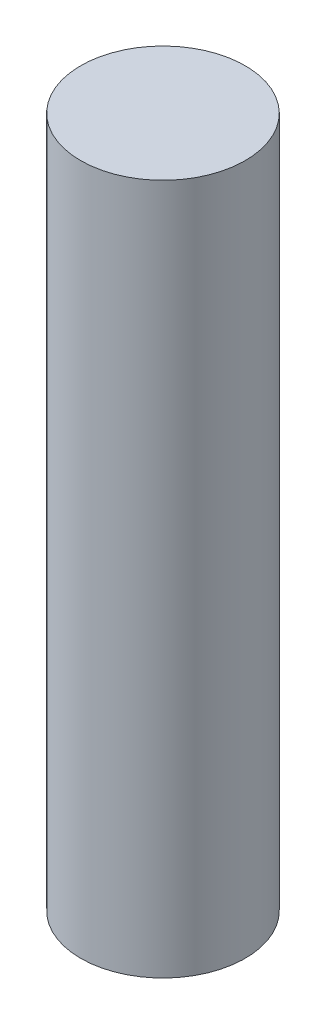
ISO-10303-21;
HEADER;
FILE_DESCRIPTION(('STEP AP214'),'2;1');
FILE_NAME('part.step','',(''),(''),'','','');
FILE_SCHEMA(('AUTOMOTIVE_DESIGN { 1 0 10303 214 1 1 1 1 }'));
ENDSEC;
DATA;
#1=APPLICATION_CONTEXT('core data for automotive mechanical design processes');
#2=APPLICATION_PROTOCOL_DEFINITION('international standard','automotive_design',2000,#1);
#3=PRODUCT_CONTEXT('',#1,'mechanical');
#4=PRODUCT('Part','Part','',(#3));
#5=PRODUCT_RELATED_PRODUCT_CATEGORY('part','',(#4));
#6=PRODUCT_DEFINITION_FORMATION('','',#4);
#7=PRODUCT_DEFINITION_CONTEXT('part definition',#1,'design');
#8=PRODUCT_DEFINITION('design','',#6,#7);
#9=PRODUCT_DEFINITION_SHAPE('','',#8);
#10=(LENGTH_UNIT() NAMED_UNIT(*) SI_UNIT(.MILLI.,.METRE.));
#11=(NAMED_UNIT(*) PLANE_ANGLE_UNIT() SI_UNIT($,.RADIAN.));
#12=(NAMED_UNIT(*) SI_UNIT($,.STERADIAN.) SOLID_ANGLE_UNIT());
#13=UNCERTAINTY_MEASURE_WITH_UNIT(LENGTH_MEASURE(1.E-05),#10,'distance_accuracy_value','');
#14=(GEOMETRIC_REPRESENTATION_CONTEXT(3) GLOBAL_UNCERTAINTY_ASSIGNED_CONTEXT((#13)) GLOBAL_UNIT_ASSIGNED_CONTEXT((#10,
#11,#12)) REPRESENTATION_CONTEXT('',''));
#15=CARTESIAN_POINT('',(0.,0.,0.));
#16=DIRECTION('',(0.,0.,1.));
#17=DIRECTION('',(1.,0.,0.));
#18=AXIS2_PLACEMENT_3D('',#15,#16,#17);
#19=CARTESIAN_POINT('',(0.,40.,0.));
#20=DIRECTION('',(0.,-1.,0.));
#21=DIRECTION('',(0.,0.,-1.));
#22=AXIS2_PLACEMENT_3D('',#19,#20,#21);
#23=CYLINDRICAL_SURFACE('',#22,4.7625);
#24=CARTESIAN_POINT('',(0.,40.,0.));
#25=DIRECTION('',(0.,1.,0.));
#26=DIRECTION('',(0.,0.,1.));
#27=AXIS2_PLACEMENT_3D('',#24,#25,#26);
#28=CIRCLE('',#27,4.7625);
#29=CARTESIAN_POINT('',(0.,40.,4.7625));
#30=VERTEX_POINT('',#29);
#31=EDGE_CURVE('E10',#30,#30,#28,.T.);
#32=ORIENTED_EDGE('',*,*,#31,.F.);
#33=EDGE_LOOP('',(#32));
#34=FACE_BOUND('',#33,.T.);
#35=CARTESIAN_POINT('',(0.,0.,0.));
#36=DIRECTION('',(0.,1.,0.));
#37=DIRECTION('',(0.,0.,1.));
#38=AXIS2_PLACEMENT_3D('',#35,#36,#37);
#39=CIRCLE('',#38,4.7625);
#40=CARTESIAN_POINT('',(0.,0.,4.7625));
#41=VERTEX_POINT('',#40);
#42=EDGE_CURVE('E39',#41,#41,#39,.T.);
#43=ORIENTED_EDGE('',*,*,#42,.T.);
#44=EDGE_LOOP('',(#43));
#45=FACE_BOUND('',#44,.T.);
#46=ADVANCED_FACE('F36',(#34,#45),#23,.T.);
#47=CARTESIAN_POINT('',(0.,40.,0.));
#48=DIRECTION('',(0.,1.,0.));
#49=DIRECTION('',(0.,0.,1.));
#50=AXIS2_PLACEMENT_3D('',#47,#48,#49);
#51=PLANE('',#50);
#52=ORIENTED_EDGE('',*,*,#31,.T.);
#53=EDGE_LOOP('',(#52));
#54=FACE_BOUND('',#53,.T.);
#55=ADVANCED_FACE('F53',(#54),#51,.T.);
#56=CARTESIAN_POINT('',(0.,0.,0.));
#57=DIRECTION('',(0.,1.,0.));
#58=DIRECTION('',(0.,0.,1.));
#59=AXIS2_PLACEMENT_3D('',#56,#57,#58);
#60=PLANE('',#59);
#61=ORIENTED_EDGE('',*,*,#42,.F.);
#62=EDGE_LOOP('',(#61));
#63=FACE_BOUND('',#62,.T.);
#64=ADVANCED_FACE('F51',(#63),#60,.F.);
#65=CLOSED_SHELL('',(#46,#55,#64));
#66=MANIFOLD_SOLID_BREP('B2',#65);
#67=ADVANCED_BREP_SHAPE_REPRESENTATION('',(#18,#66),#14);
#68=SHAPE_DEFINITION_REPRESENTATION(#9,#67);
ENDSEC;
END-ISO-10303-21;
